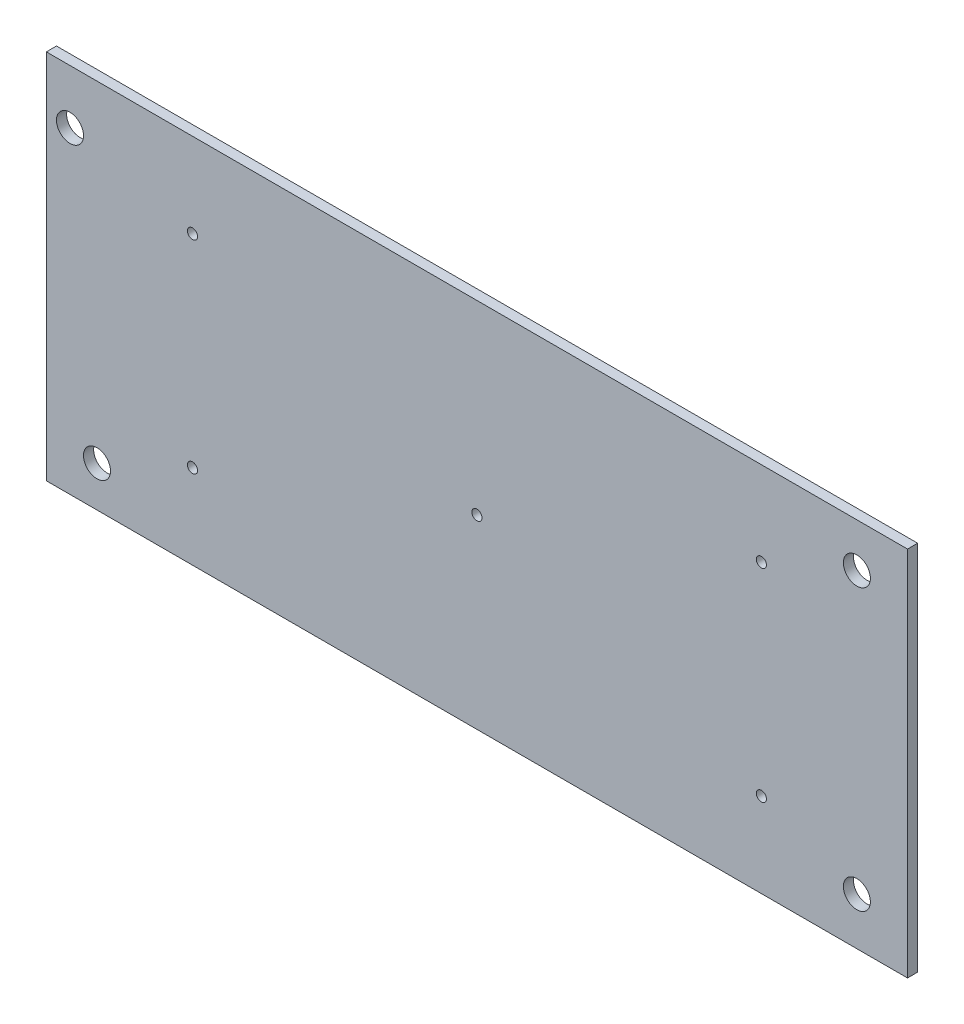
ISO-10303-21;
HEADER;
FILE_DESCRIPTION(('STEP AP214'),'2;1');
FILE_NAME('part.step','',(''),(''),'','','');
FILE_SCHEMA(('AUTOMOTIVE_DESIGN { 1 0 10303 214 1 1 1 1 }'));
ENDSEC;
DATA;
#1=APPLICATION_CONTEXT('core data for automotive mechanical design processes');
#2=APPLICATION_PROTOCOL_DEFINITION('international standard','automotive_design',2000,#1);
#3=PRODUCT_CONTEXT('',#1,'mechanical');
#4=PRODUCT('Part','Part','',(#3));
#5=PRODUCT_RELATED_PRODUCT_CATEGORY('part','',(#4));
#6=PRODUCT_DEFINITION_FORMATION('','',#4);
#7=PRODUCT_DEFINITION_CONTEXT('part definition',#1,'design');
#8=PRODUCT_DEFINITION('design','',#6,#7);
#9=PRODUCT_DEFINITION_SHAPE('','',#8);
#10=(LENGTH_UNIT() NAMED_UNIT(*) SI_UNIT(.MILLI.,.METRE.));
#11=(NAMED_UNIT(*) PLANE_ANGLE_UNIT() SI_UNIT($,.RADIAN.));
#12=(NAMED_UNIT(*) SI_UNIT($,.STERADIAN.) SOLID_ANGLE_UNIT());
#13=UNCERTAINTY_MEASURE_WITH_UNIT(LENGTH_MEASURE(1.E-05),#10,'distance_accuracy_value','');
#14=(GEOMETRIC_REPRESENTATION_CONTEXT(3) GLOBAL_UNCERTAINTY_ASSIGNED_CONTEXT((#13)) GLOBAL_UNIT_ASSIGNED_CONTEXT((#10,
#11,#12)) REPRESENTATION_CONTEXT('',''));
#15=CARTESIAN_POINT('',(0.,0.,0.));
#16=DIRECTION('',(0.,0.,1.));
#17=DIRECTION('',(1.,0.,0.));
#18=AXIS2_PLACEMENT_3D('',#15,#16,#17);
#19=CARTESIAN_POINT('',(0.,0.,3.));
#20=DIRECTION('',(0.,0.,1.));
#21=DIRECTION('',(1.,0.,0.));
#22=AXIS2_PLACEMENT_3D('',#19,#20,#21);
#23=PLANE('',#22);
#24=CARTESIAN_POINT('',(71.0964756636362,23.6818181818181,3.));
#25=DIRECTION('',(0.,0.,1.));
#26=DIRECTION('',(-1.,0.,0.));
#27=AXIS2_PLACEMENT_3D('',#24,#25,#26);
#28=CIRCLE('',#27,1.5);
#29=CARTESIAN_POINT('',(69.5964756636362,23.6818181818181,3.));
#30=VERTEX_POINT('',#29);
#31=EDGE_CURVE('E182',#30,#30,#28,.T.);
#32=ORIENTED_EDGE('',*,*,#31,.F.);
#33=EDGE_LOOP('',(#32));
#34=FACE_BOUND('',#33,.T.);
#35=CARTESIAN_POINT('',(-97.3692029363636,-36.3181818181818,3.));
#36=DIRECTION('',(0.,0.,1.));
#37=DIRECTION('',(1.,0.,0.));
#38=AXIS2_PLACEMENT_3D('',#35,#36,#37);
#39=CIRCLE('',#38,1.5);
#40=CARTESIAN_POINT('',(-95.8692029363636,-36.3181818181818,3.));
#41=VERTEX_POINT('',#40);
#42=EDGE_CURVE('E166',#41,#41,#39,.T.);
#43=ORIENTED_EDGE('',*,*,#42,.F.);
#44=EDGE_LOOP('',(#43));
#45=FACE_BOUND('',#44,.T.);
#46=CARTESIAN_POINT('',(99.3636363636363,35.6818181818182,3.));
#47=DIRECTION('',(0.,0.,1.));
#48=DIRECTION('',(1.,0.,0.));
#49=AXIS2_PLACEMENT_3D('',#46,#47,#48);
#50=CIRCLE('',#49,4.00000000000001);
#51=CARTESIAN_POINT('',(103.363636363636,35.6818181818182,3.));
#52=VERTEX_POINT('',#51);
#53=EDGE_CURVE('E150',#52,#52,#50,.T.);
#54=ORIENTED_EDGE('',*,*,#53,.F.);
#55=EDGE_LOOP('',(#54));
#56=FACE_BOUND('',#55,.T.);
#57=CARTESIAN_POINT('',(-133.636363636364,32.6818181818182,3.));
#58=DIRECTION('',(0.,0.,1.));
#59=DIRECTION('',(1.,0.,0.));
#60=AXIS2_PLACEMENT_3D('',#57,#58,#59);
#61=CIRCLE('',#60,3.99999999999999);
#62=CARTESIAN_POINT('',(-129.636363636364,32.6818181818182,3.));
#63=VERTEX_POINT('',#62);
#64=EDGE_CURVE('E134',#63,#63,#61,.T.);
#65=ORIENTED_EDGE('',*,*,#64,.F.);
#66=EDGE_LOOP('',(#65));
#67=FACE_BOUND('',#66,.T.);
#68=DIRECTION('',(0.,-1.,0.));
#69=VECTOR('',#68,1.);
#70=CARTESIAN_POINT('',(-140.636363636364,48.6818181818182,3.));
#71=LINE('',#70,#69);
#72=CARTESIAN_POINT('',(-140.636363636364,48.6818181818182,3.));
#73=VERTEX_POINT('',#72);
#74=CARTESIAN_POINT('',(-140.636363636364,-61.3181818181818,3.));
#75=VERTEX_POINT('',#74);
#76=EDGE_CURVE('E92',#73,#75,#71,.T.);
#77=ORIENTED_EDGE('',*,*,#76,.T.);
#78=DIRECTION('',(1.,0.,0.));
#79=VECTOR('',#78,1.);
#80=CARTESIAN_POINT('',(-140.636363636364,-61.3181818181818,3.));
#81=LINE('',#80,#79);
#82=CARTESIAN_POINT('',(114.363636363636,-61.3181818181818,3.));
#83=VERTEX_POINT('',#82);
#84=EDGE_CURVE('E87',#75,#83,#81,.T.);
#85=ORIENTED_EDGE('',*,*,#84,.T.);
#86=DIRECTION('',(0.,1.,0.));
#87=VECTOR('',#86,1.);
#88=CARTESIAN_POINT('',(114.363636363636,48.6818181818182,3.));
#89=LINE('',#88,#87);
#90=CARTESIAN_POINT('',(114.363636363636,48.6818181818182,3.));
#91=VERTEX_POINT('',#90);
#92=EDGE_CURVE('E90',#83,#91,#89,.T.);
#93=ORIENTED_EDGE('',*,*,#92,.T.);
#94=DIRECTION('',(-1.,0.,0.));
#95=VECTOR('',#94,1.);
#96=CARTESIAN_POINT('',(-140.636363636364,48.6818181818182,3.));
#97=LINE('',#96,#95);
#98=EDGE_CURVE('E57',#91,#73,#97,.T.);
#99=ORIENTED_EDGE('',*,*,#98,.T.);
#100=EDGE_LOOP('',(#77,#85,#93,#99));
#101=FACE_BOUND('',#100,.T.);
#102=CARTESIAN_POINT('',(-125.636363636364,-49.3181818181818,3.));
#103=DIRECTION('',(0.,0.,1.));
#104=DIRECTION('',(1.,0.,0.));
#105=AXIS2_PLACEMENT_3D('',#102,#103,#104);
#106=CIRCLE('',#105,4.00000000000001);
#107=CARTESIAN_POINT('',(-121.636363636364,-49.3181818181818,3.));
#108=VERTEX_POINT('',#107);
#109=EDGE_CURVE('E112',#108,#108,#106,.T.);
#110=ORIENTED_EDGE('',*,*,#109,.F.);
#111=EDGE_LOOP('',(#110));
#112=FACE_BOUND('',#111,.T.);
#113=CARTESIAN_POINT('',(99.3636363636363,-47.3181818181818,3.));
#114=DIRECTION('',(0.,0.,1.));
#115=DIRECTION('',(1.,0.,0.));
#116=AXIS2_PLACEMENT_3D('',#113,#114,#115);
#117=CIRCLE('',#116,4.00000000000001);
#118=CARTESIAN_POINT('',(103.363636363636,-47.3181818181818,3.));
#119=VERTEX_POINT('',#118);
#120=EDGE_CURVE('E142',#119,#119,#117,.T.);
#121=ORIENTED_EDGE('',*,*,#120,.F.);
#122=EDGE_LOOP('',(#121));
#123=FACE_BOUND('',#122,.T.);
#124=CARTESIAN_POINT('',(-97.3692029363636,23.6818181818182,3.));
#125=DIRECTION('',(0.,0.,1.));
#126=DIRECTION('',(1.,0.,0.));
#127=AXIS2_PLACEMENT_3D('',#124,#125,#126);
#128=CIRCLE('',#127,1.5);
#129=CARTESIAN_POINT('',(-95.8692029363636,23.6818181818182,3.));
#130=VERTEX_POINT('',#129);
#131=EDGE_CURVE('E158',#130,#130,#128,.T.);
#132=ORIENTED_EDGE('',*,*,#131,.F.);
#133=EDGE_LOOP('',(#132));
#134=FACE_BOUND('',#133,.T.);
#135=CARTESIAN_POINT('',(71.0964756636361,-36.3181818181819,3.));
#136=DIRECTION('',(0.,0.,1.));
#137=DIRECTION('',(-1.,0.,0.));
#138=AXIS2_PLACEMENT_3D('',#135,#136,#137);
#139=CIRCLE('',#138,1.5);
#140=CARTESIAN_POINT('',(69.5964756636361,-36.3181818181819,3.));
#141=VERTEX_POINT('',#140);
#142=EDGE_CURVE('E174',#141,#141,#139,.T.);
#143=ORIENTED_EDGE('',*,*,#142,.F.);
#144=EDGE_LOOP('',(#143));
#145=FACE_BOUND('',#144,.T.);
#146=CARTESIAN_POINT('',(-13.1363636363637,-6.31818181818181,3.));
#147=DIRECTION('',(0.,0.,1.));
#148=DIRECTION('',(1.,0.,0.));
#149=AXIS2_PLACEMENT_3D('',#146,#147,#148);
#150=CIRCLE('',#149,1.5);
#151=CARTESIAN_POINT('',(-11.6363636363637,-6.31818181818181,3.));
#152=VERTEX_POINT('',#151);
#153=EDGE_CURVE('E190',#152,#152,#150,.T.);
#154=ORIENTED_EDGE('',*,*,#153,.F.);
#155=EDGE_LOOP('',(#154));
#156=FACE_BOUND('',#155,.T.);
#157=ADVANCED_FACE('F39',(#34,#45,#56,#67,#101,#112,#123,#134,#145,#156),#23,.T.);
#158=CARTESIAN_POINT('',(0.,0.,0.));
#159=DIRECTION('',(0.,0.,1.));
#160=DIRECTION('',(1.,0.,0.));
#161=AXIS2_PLACEMENT_3D('',#158,#159,#160);
#162=PLANE('',#161);
#163=DIRECTION('',(0.,-1.,0.));
#164=VECTOR('',#163,1.);
#165=CARTESIAN_POINT('',(-140.636363636364,48.6818181818182,0.));
#166=LINE('',#165,#164);
#167=CARTESIAN_POINT('',(-140.636363636364,48.6818181818182,0.));
#168=VERTEX_POINT('',#167);
#169=CARTESIAN_POINT('',(-140.636363636364,-61.3181818181818,0.));
#170=VERTEX_POINT('',#169);
#171=EDGE_CURVE('E108',#168,#170,#166,.T.);
#172=ORIENTED_EDGE('',*,*,#171,.F.);
#173=DIRECTION('',(-1.,0.,0.));
#174=VECTOR('',#173,1.);
#175=CARTESIAN_POINT('',(-140.636363636364,48.6818181818182,0.));
#176=LINE('',#175,#174);
#177=CARTESIAN_POINT('',(114.363636363636,48.6818181818182,0.));
#178=VERTEX_POINT('',#177);
#179=EDGE_CURVE('E80',#178,#168,#176,.T.);
#180=ORIENTED_EDGE('',*,*,#179,.F.);
#181=DIRECTION('',(0.,1.,0.));
#182=VECTOR('',#181,1.);
#183=CARTESIAN_POINT('',(114.363636363636,48.6818181818182,0.));
#184=LINE('',#183,#182);
#185=CARTESIAN_POINT('',(114.363636363636,-61.3181818181818,0.));
#186=VERTEX_POINT('',#185);
#187=EDGE_CURVE('E74',#186,#178,#184,.T.);
#188=ORIENTED_EDGE('',*,*,#187,.F.);
#189=DIRECTION('',(1.,0.,0.));
#190=VECTOR('',#189,1.);
#191=CARTESIAN_POINT('',(-140.636363636364,-61.3181818181818,0.));
#192=LINE('',#191,#190);
#193=EDGE_CURVE('E97',#170,#186,#192,.T.);
#194=ORIENTED_EDGE('',*,*,#193,.F.);
#195=EDGE_LOOP('',(#172,#180,#188,#194));
#196=FACE_BOUND('',#195,.T.);
#197=CARTESIAN_POINT('',(-125.636363636364,-49.3181818181818,0.));
#198=DIRECTION('',(0.,0.,1.));
#199=DIRECTION('',(1.,0.,0.));
#200=AXIS2_PLACEMENT_3D('',#197,#198,#199);
#201=CIRCLE('',#200,4.00000000000001);
#202=CARTESIAN_POINT('',(-121.636363636364,-49.3181818181818,0.));
#203=VERTEX_POINT('',#202);
#204=EDGE_CURVE('E130',#203,#203,#201,.T.);
#205=ORIENTED_EDGE('',*,*,#204,.T.);
#206=EDGE_LOOP('',(#205));
#207=FACE_BOUND('',#206,.T.);
#208=CARTESIAN_POINT('',(-133.636363636364,32.6818181818182,0.));
#209=DIRECTION('',(0.,0.,1.));
#210=DIRECTION('',(1.,0.,0.));
#211=AXIS2_PLACEMENT_3D('',#208,#209,#210);
#212=CIRCLE('',#211,3.99999999999999);
#213=CARTESIAN_POINT('',(-129.636363636364,32.6818181818182,0.));
#214=VERTEX_POINT('',#213);
#215=EDGE_CURVE('E138',#214,#214,#212,.T.);
#216=ORIENTED_EDGE('',*,*,#215,.T.);
#217=EDGE_LOOP('',(#216));
#218=FACE_BOUND('',#217,.T.);
#219=CARTESIAN_POINT('',(99.3636363636363,-47.3181818181818,0.));
#220=DIRECTION('',(0.,0.,1.));
#221=DIRECTION('',(1.,0.,0.));
#222=AXIS2_PLACEMENT_3D('',#219,#220,#221);
#223=CIRCLE('',#222,4.00000000000001);
#224=CARTESIAN_POINT('',(103.363636363636,-47.3181818181818,0.));
#225=VERTEX_POINT('',#224);
#226=EDGE_CURVE('E146',#225,#225,#223,.T.);
#227=ORIENTED_EDGE('',*,*,#226,.T.);
#228=EDGE_LOOP('',(#227));
#229=FACE_BOUND('',#228,.T.);
#230=CARTESIAN_POINT('',(99.3636363636363,35.6818181818182,0.));
#231=DIRECTION('',(0.,0.,1.));
#232=DIRECTION('',(1.,0.,0.));
#233=AXIS2_PLACEMENT_3D('',#230,#231,#232);
#234=CIRCLE('',#233,4.00000000000001);
#235=CARTESIAN_POINT('',(103.363636363636,35.6818181818182,0.));
#236=VERTEX_POINT('',#235);
#237=EDGE_CURVE('E154',#236,#236,#234,.T.);
#238=ORIENTED_EDGE('',*,*,#237,.T.);
#239=EDGE_LOOP('',(#238));
#240=FACE_BOUND('',#239,.T.);
#241=CARTESIAN_POINT('',(-97.3692029363636,23.6818181818182,0.));
#242=DIRECTION('',(0.,0.,1.));
#243=DIRECTION('',(1.,0.,0.));
#244=AXIS2_PLACEMENT_3D('',#241,#242,#243);
#245=CIRCLE('',#244,1.5);
#246=CARTESIAN_POINT('',(-95.8692029363636,23.6818181818182,0.));
#247=VERTEX_POINT('',#246);
#248=EDGE_CURVE('E162',#247,#247,#245,.T.);
#249=ORIENTED_EDGE('',*,*,#248,.T.);
#250=EDGE_LOOP('',(#249));
#251=FACE_BOUND('',#250,.T.);
#252=CARTESIAN_POINT('',(-97.3692029363636,-36.3181818181818,0.));
#253=DIRECTION('',(0.,0.,1.));
#254=DIRECTION('',(1.,0.,0.));
#255=AXIS2_PLACEMENT_3D('',#252,#253,#254);
#256=CIRCLE('',#255,1.5);
#257=CARTESIAN_POINT('',(-95.8692029363636,-36.3181818181818,0.));
#258=VERTEX_POINT('',#257);
#259=EDGE_CURVE('E170',#258,#258,#256,.T.);
#260=ORIENTED_EDGE('',*,*,#259,.T.);
#261=EDGE_LOOP('',(#260));
#262=FACE_BOUND('',#261,.T.);
#263=CARTESIAN_POINT('',(71.0964756636361,-36.3181818181819,0.));
#264=DIRECTION('',(0.,0.,1.));
#265=DIRECTION('',(-1.,0.,0.));
#266=AXIS2_PLACEMENT_3D('',#263,#264,#265);
#267=CIRCLE('',#266,1.5);
#268=CARTESIAN_POINT('',(69.5964756636361,-36.3181818181819,0.));
#269=VERTEX_POINT('',#268);
#270=EDGE_CURVE('E178',#269,#269,#267,.T.);
#271=ORIENTED_EDGE('',*,*,#270,.T.);
#272=EDGE_LOOP('',(#271));
#273=FACE_BOUND('',#272,.T.);
#274=CARTESIAN_POINT('',(71.0964756636362,23.6818181818181,0.));
#275=DIRECTION('',(0.,0.,1.));
#276=DIRECTION('',(-1.,0.,0.));
#277=AXIS2_PLACEMENT_3D('',#274,#275,#276);
#278=CIRCLE('',#277,1.5);
#279=CARTESIAN_POINT('',(69.5964756636362,23.6818181818181,0.));
#280=VERTEX_POINT('',#279);
#281=EDGE_CURVE('E186',#280,#280,#278,.T.);
#282=ORIENTED_EDGE('',*,*,#281,.T.);
#283=EDGE_LOOP('',(#282));
#284=FACE_BOUND('',#283,.T.);
#285=CARTESIAN_POINT('',(-13.1363636363637,-6.31818181818181,0.));
#286=DIRECTION('',(0.,0.,1.));
#287=DIRECTION('',(1.,0.,0.));
#288=AXIS2_PLACEMENT_3D('',#285,#286,#287);
#289=CIRCLE('',#288,1.5);
#290=CARTESIAN_POINT('',(-11.6363636363637,-6.31818181818181,0.));
#291=VERTEX_POINT('',#290);
#292=EDGE_CURVE('E194',#291,#291,#289,.T.);
#293=ORIENTED_EDGE('',*,*,#292,.T.);
#294=EDGE_LOOP('',(#293));
#295=FACE_BOUND('',#294,.T.);
#296=ADVANCED_FACE('F125',(#196,#207,#218,#229,#240,#251,#262,#273,#284,#295),#162,.F.);
#297=CARTESIAN_POINT('',(-140.636363636364,48.6818181818182,3.));
#298=DIRECTION('',(1.,0.,0.));
#299=DIRECTION('',(0.,1.,0.));
#300=AXIS2_PLACEMENT_3D('',#297,#298,#299);
#301=PLANE('',#300);
#302=ORIENTED_EDGE('',*,*,#171,.T.);
#303=DIRECTION('',(0.,0.,-1.));
#304=VECTOR('',#303,1.);
#305=CARTESIAN_POINT('',(-140.636363636364,-61.3181818181818,3.));
#306=LINE('',#305,#304);
#307=EDGE_CURVE('E11',#75,#170,#306,.T.);
#308=ORIENTED_EDGE('',*,*,#307,.F.);
#309=ORIENTED_EDGE('',*,*,#76,.F.);
#310=DIRECTION('',(0.,0.,-1.));
#311=VECTOR('',#310,1.);
#312=CARTESIAN_POINT('',(-140.636363636364,48.6818181818182,3.));
#313=LINE('',#312,#311);
#314=EDGE_CURVE('E104',#73,#168,#313,.T.);
#315=ORIENTED_EDGE('',*,*,#314,.T.);
#316=EDGE_LOOP('',(#302,#308,#309,#315));
#317=FACE_BOUND('',#316,.T.);
#318=ADVANCED_FACE('F41',(#317),#301,.F.);
#319=CARTESIAN_POINT('',(-140.636363636364,-61.3181818181818,3.));
#320=DIRECTION('',(0.,1.,0.));
#321=DIRECTION('',(0.,0.,1.));
#322=AXIS2_PLACEMENT_3D('',#319,#320,#321);
#323=PLANE('',#322);
#324=ORIENTED_EDGE('',*,*,#193,.T.);
#325=DIRECTION('',(0.,0.,-1.));
#326=VECTOR('',#325,1.);
#327=CARTESIAN_POINT('',(114.363636363636,-61.3181818181818,3.));
#328=LINE('',#327,#326);
#329=EDGE_CURVE('E49',#83,#186,#328,.T.);
#330=ORIENTED_EDGE('',*,*,#329,.F.);
#331=ORIENTED_EDGE('',*,*,#84,.F.);
#332=ORIENTED_EDGE('',*,*,#307,.T.);
#333=EDGE_LOOP('',(#324,#330,#331,#332));
#334=FACE_BOUND('',#333,.T.);
#335=ADVANCED_FACE('F96',(#334),#323,.F.);
#336=CARTESIAN_POINT('',(114.363636363636,48.6818181818182,3.));
#337=DIRECTION('',(-1.,0.,0.));
#338=DIRECTION('',(0.,0.,1.));
#339=AXIS2_PLACEMENT_3D('',#336,#337,#338);
#340=PLANE('',#339);
#341=ORIENTED_EDGE('',*,*,#187,.T.);
#342=DIRECTION('',(0.,0.,-1.));
#343=VECTOR('',#342,1.);
#344=CARTESIAN_POINT('',(114.363636363636,48.6818181818182,3.));
#345=LINE('',#344,#343);
#346=EDGE_CURVE('E99',#91,#178,#345,.T.);
#347=ORIENTED_EDGE('',*,*,#346,.F.);
#348=ORIENTED_EDGE('',*,*,#92,.F.);
#349=ORIENTED_EDGE('',*,*,#329,.T.);
#350=EDGE_LOOP('',(#341,#347,#348,#349));
#351=FACE_BOUND('',#350,.T.);
#352=ADVANCED_FACE('F100',(#351),#340,.F.);
#353=CARTESIAN_POINT('',(-140.636363636364,48.6818181818182,3.));
#354=DIRECTION('',(0.,-1.,0.));
#355=DIRECTION('',(0.,0.,-1.));
#356=AXIS2_PLACEMENT_3D('',#353,#354,#355);
#357=PLANE('',#356);
#358=ORIENTED_EDGE('',*,*,#179,.T.);
#359=ORIENTED_EDGE('',*,*,#314,.F.);
#360=ORIENTED_EDGE('',*,*,#98,.F.);
#361=ORIENTED_EDGE('',*,*,#346,.T.);
#362=EDGE_LOOP('',(#358,#359,#360,#361));
#363=FACE_BOUND('',#362,.T.);
#364=ADVANCED_FACE('F122',(#363),#357,.F.);
#365=CARTESIAN_POINT('',(-125.636363636364,-49.3181818181818,3.));
#366=DIRECTION('',(0.,0.,-1.));
#367=DIRECTION('',(-1.,0.,0.));
#368=AXIS2_PLACEMENT_3D('',#365,#366,#367);
#369=CYLINDRICAL_SURFACE('',#368,4.00000000000001);
#370=ORIENTED_EDGE('',*,*,#109,.T.);
#371=EDGE_LOOP('',(#370));
#372=FACE_BOUND('',#371,.T.);
#373=ORIENTED_EDGE('',*,*,#204,.F.);
#374=EDGE_LOOP('',(#373));
#375=FACE_BOUND('',#374,.T.);
#376=ADVANCED_FACE('F215',(#372,#375),#369,.F.);
#377=CARTESIAN_POINT('',(-133.636363636364,32.6818181818182,3.));
#378=DIRECTION('',(0.,0.,-1.));
#379=DIRECTION('',(-1.,0.,0.));
#380=AXIS2_PLACEMENT_3D('',#377,#378,#379);
#381=CYLINDRICAL_SURFACE('',#380,3.99999999999999);
#382=ORIENTED_EDGE('',*,*,#64,.T.);
#383=EDGE_LOOP('',(#382));
#384=FACE_BOUND('',#383,.T.);
#385=ORIENTED_EDGE('',*,*,#215,.F.);
#386=EDGE_LOOP('',(#385));
#387=FACE_BOUND('',#386,.T.);
#388=ADVANCED_FACE('F261',(#384,#387),#381,.F.);
#389=CARTESIAN_POINT('',(99.3636363636363,-47.3181818181818,3.));
#390=DIRECTION('',(0.,0.,-1.));
#391=DIRECTION('',(-1.,0.,0.));
#392=AXIS2_PLACEMENT_3D('',#389,#390,#391);
#393=CYLINDRICAL_SURFACE('',#392,4.00000000000001);
#394=ORIENTED_EDGE('',*,*,#120,.T.);
#395=EDGE_LOOP('',(#394));
#396=FACE_BOUND('',#395,.T.);
#397=ORIENTED_EDGE('',*,*,#226,.F.);
#398=EDGE_LOOP('',(#397));
#399=FACE_BOUND('',#398,.T.);
#400=ADVANCED_FACE('F269',(#396,#399),#393,.F.);
#401=CARTESIAN_POINT('',(99.3636363636363,35.6818181818182,3.));
#402=DIRECTION('',(0.,0.,-1.));
#403=DIRECTION('',(-1.,0.,0.));
#404=AXIS2_PLACEMENT_3D('',#401,#402,#403);
#405=CYLINDRICAL_SURFACE('',#404,4.00000000000001);
#406=ORIENTED_EDGE('',*,*,#53,.T.);
#407=EDGE_LOOP('',(#406));
#408=FACE_BOUND('',#407,.T.);
#409=ORIENTED_EDGE('',*,*,#237,.F.);
#410=EDGE_LOOP('',(#409));
#411=FACE_BOUND('',#410,.T.);
#412=ADVANCED_FACE('F277',(#408,#411),#405,.F.);
#413=CARTESIAN_POINT('',(-97.3692029363636,23.6818181818182,3.));
#414=DIRECTION('',(0.,0.,-1.));
#415=DIRECTION('',(-1.,0.,0.));
#416=AXIS2_PLACEMENT_3D('',#413,#414,#415);
#417=CYLINDRICAL_SURFACE('',#416,1.5);
#418=ORIENTED_EDGE('',*,*,#131,.T.);
#419=EDGE_LOOP('',(#418));
#420=FACE_BOUND('',#419,.T.);
#421=ORIENTED_EDGE('',*,*,#248,.F.);
#422=EDGE_LOOP('',(#421));
#423=FACE_BOUND('',#422,.T.);
#424=ADVANCED_FACE('F286',(#420,#423),#417,.F.);
#425=CARTESIAN_POINT('',(-97.3692029363636,-36.3181818181818,3.));
#426=DIRECTION('',(0.,0.,-1.));
#427=DIRECTION('',(-1.,0.,0.));
#428=AXIS2_PLACEMENT_3D('',#425,#426,#427);
#429=CYLINDRICAL_SURFACE('',#428,1.5);
#430=ORIENTED_EDGE('',*,*,#42,.T.);
#431=EDGE_LOOP('',(#430));
#432=FACE_BOUND('',#431,.T.);
#433=ORIENTED_EDGE('',*,*,#259,.F.);
#434=EDGE_LOOP('',(#433));
#435=FACE_BOUND('',#434,.T.);
#436=ADVANCED_FACE('F295',(#432,#435),#429,.F.);
#437=CARTESIAN_POINT('',(71.0964756636361,-36.3181818181819,3.));
#438=DIRECTION('',(0.,0.,-1.));
#439=DIRECTION('',(-1.,0.,0.));
#440=AXIS2_PLACEMENT_3D('',#437,#438,#439);
#441=CYLINDRICAL_SURFACE('',#440,1.5);
#442=ORIENTED_EDGE('',*,*,#142,.T.);
#443=EDGE_LOOP('',(#442));
#444=FACE_BOUND('',#443,.T.);
#445=ORIENTED_EDGE('',*,*,#270,.F.);
#446=EDGE_LOOP('',(#445));
#447=FACE_BOUND('',#446,.T.);
#448=ADVANCED_FACE('F304',(#444,#447),#441,.F.);
#449=CARTESIAN_POINT('',(71.0964756636362,23.6818181818181,3.));
#450=DIRECTION('',(0.,0.,-1.));
#451=DIRECTION('',(-1.,0.,0.));
#452=AXIS2_PLACEMENT_3D('',#449,#450,#451);
#453=CYLINDRICAL_SURFACE('',#452,1.5);
#454=ORIENTED_EDGE('',*,*,#31,.T.);
#455=EDGE_LOOP('',(#454));
#456=FACE_BOUND('',#455,.T.);
#457=ORIENTED_EDGE('',*,*,#281,.F.);
#458=EDGE_LOOP('',(#457));
#459=FACE_BOUND('',#458,.T.);
#460=ADVANCED_FACE('F313',(#456,#459),#453,.F.);
#461=CARTESIAN_POINT('',(-13.1363636363637,-6.31818181818181,3.));
#462=DIRECTION('',(0.,0.,-1.));
#463=DIRECTION('',(-1.,0.,0.));
#464=AXIS2_PLACEMENT_3D('',#461,#462,#463);
#465=CYLINDRICAL_SURFACE('',#464,1.5);
#466=ORIENTED_EDGE('',*,*,#153,.T.);
#467=EDGE_LOOP('',(#466));
#468=FACE_BOUND('',#467,.T.);
#469=ORIENTED_EDGE('',*,*,#292,.F.);
#470=EDGE_LOOP('',(#469));
#471=FACE_BOUND('',#470,.T.);
#472=ADVANCED_FACE('F202',(#468,#471),#465,.F.);
#473=CLOSED_SHELL('',(#157,#296,#318,#335,#352,#364,#376,#388,#400,#412,#424,#436,#448,#460,#472));
#474=MANIFOLD_SOLID_BREP('B2',#473);
#475=ADVANCED_BREP_SHAPE_REPRESENTATION('',(#18,#474),#14);
#476=SHAPE_DEFINITION_REPRESENTATION(#9,#475);
ENDSEC;
END-ISO-10303-21;
